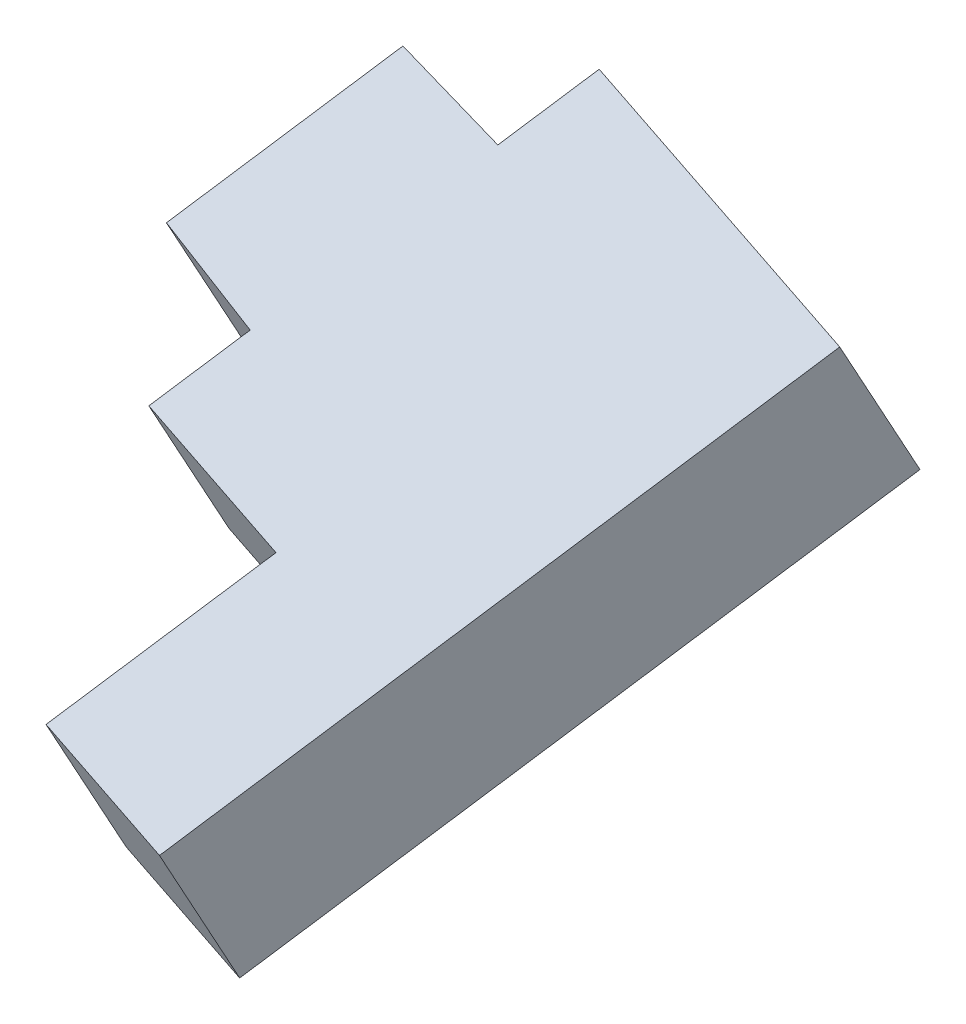
ISO-10303-21;
HEADER;
FILE_DESCRIPTION(('STEP AP214'),'2;1');
FILE_NAME('part.step','',(''),(''),'','','');
FILE_SCHEMA(('AUTOMOTIVE_DESIGN { 1 0 10303 214 1 1 1 1 }'));
ENDSEC;
DATA;
#1=APPLICATION_CONTEXT('core data for automotive mechanical design processes');
#2=APPLICATION_PROTOCOL_DEFINITION('international standard','automotive_design',2000,#1);
#3=PRODUCT_CONTEXT('',#1,'mechanical');
#4=PRODUCT('Part','Part','',(#3));
#5=PRODUCT_RELATED_PRODUCT_CATEGORY('part','',(#4));
#6=PRODUCT_DEFINITION_FORMATION('','',#4);
#7=PRODUCT_DEFINITION_CONTEXT('part definition',#1,'design');
#8=PRODUCT_DEFINITION('design','',#6,#7);
#9=PRODUCT_DEFINITION_SHAPE('','',#8);
#10=(LENGTH_UNIT() NAMED_UNIT(*) SI_UNIT(.MILLI.,.METRE.));
#11=(NAMED_UNIT(*) PLANE_ANGLE_UNIT() SI_UNIT($,.RADIAN.));
#12=(NAMED_UNIT(*) SI_UNIT($,.STERADIAN.) SOLID_ANGLE_UNIT());
#13=UNCERTAINTY_MEASURE_WITH_UNIT(LENGTH_MEASURE(1.E-05),#10,'distance_accuracy_value','');
#14=(GEOMETRIC_REPRESENTATION_CONTEXT(3) GLOBAL_UNCERTAINTY_ASSIGNED_CONTEXT((#13)) GLOBAL_UNIT_ASSIGNED_CONTEXT((#10,
#11,#12)) REPRESENTATION_CONTEXT('',''));
#15=CARTESIAN_POINT('',(0.,0.,0.));
#16=DIRECTION('',(0.,0.,1.));
#17=DIRECTION('',(1.,0.,0.));
#18=AXIS2_PLACEMENT_3D('',#15,#16,#17);
#19=CARTESIAN_POINT('',(-21.5484862330161,269.739443662729,-65.2653013321246));
#20=DIRECTION('',(0.282555355269363,0.449026404664586,-0.84766606580811));
#21=DIRECTION('',(0.,0.883674940467671,0.468101057026641));
#22=AXIS2_PLACEMENT_3D('',#19,#20,#21);
#23=PLANE('',#22);
#24=DIRECTION('',(0.948683298050516,0.,0.316227766016831));
#25=VECTOR('',#24,1.);
#26=CARTESIAN_POINT('',(-20.6965185320382,264.378332736353,-67.8212044350583));
#27=LINE('',#26,#25);
#28=CARTESIAN_POINT('',(-27.9254852631831,264.378332736353,-70.2308600121066));
#29=VERTEX_POINT('',#28);
#30=CARTESIAN_POINT('',(-20.6965185320382,264.378332736353,-67.8212044350583));
#31=VERTEX_POINT('',#30);
#32=EDGE_CURVE('E152',#29,#31,#27,.T.);
#33=ORIENTED_EDGE('',*,*,#32,.T.);
#34=DIRECTION('',(0.141994616829656,-0.893518487729266,-0.425983850488964));
#35=VECTOR('',#34,1.);
#36=CARTESIAN_POINT('',(-21.5484862330161,269.739443662729,-65.2653013321246));
#37=LINE('',#36,#35);
#38=CARTESIAN_POINT('',(-21.5484862330161,269.739443662729,-65.2653013321246));
#39=VERTEX_POINT('',#38);
#40=EDGE_CURVE('E11',#39,#31,#37,.T.);
#41=ORIENTED_EDGE('',*,*,#40,.F.);
#42=DIRECTION('',(0.948683298050516,0.,0.316227766016831));
#43=VECTOR('',#42,1.);
#44=CARTESIAN_POINT('',(-21.5484862330161,269.739443662729,-65.2653013321246));
#45=LINE('',#44,#43);
#46=CARTESIAN_POINT('',(-28.7774529641611,269.739443662729,-67.6749569091728));
#47=VERTEX_POINT('',#46);
#48=EDGE_CURVE('E180',#47,#39,#45,.T.);
#49=ORIENTED_EDGE('',*,*,#48,.F.);
#50=DIRECTION('',(0.141994616829656,-0.893518487729266,-0.425983850488964));
#51=VECTOR('',#50,1.);
#52=CARTESIAN_POINT('',(-28.7774529641611,269.739443662729,-67.6749569091728));
#53=LINE('',#52,#51);
#54=EDGE_CURVE('E148',#47,#29,#53,.T.);
#55=ORIENTED_EDGE('',*,*,#54,.T.);
#56=EDGE_LOOP('',(#33,#41,#49,#55));
#57=FACE_BOUND('',#56,.T.);
#58=ADVANCED_FACE('F39',(#57),#23,.F.);
#59=CARTESIAN_POINT('',(-14.3231504377463,281.22167712297,-86.9413087179341));
#60=DIRECTION('',(-0.948683298050514,0.,-0.316227766016837));
#61=DIRECTION('',(-0.316227766016837,0.,0.948683298050514));
#62=AXIS2_PLACEMENT_3D('',#59,#60,#61);
#63=PLANE('',#62);
#64=DIRECTION('',(0.282555355269368,0.449026404664587,-0.847666065808108));
#65=VECTOR('',#64,1.);
#66=CARTESIAN_POINT('',(-13.4711827367684,275.860566196595,-89.4972118208679));
#67=LINE('',#66,#65);
#68=CARTESIAN_POINT('',(-13.4711827367684,275.860566196595,-89.4972118208679));
#69=VERTEX_POINT('',#68);
#70=EDGE_CURVE('E156',#31,#69,#67,.T.);
#71=ORIENTED_EDGE('',*,*,#70,.T.);
#72=DIRECTION('',(0.141994616829656,-0.893518487729266,-0.425983850488964));
#73=VECTOR('',#72,1.);
#74=CARTESIAN_POINT('',(-14.3231504377463,281.22167712297,-86.9413087179341));
#75=LINE('',#74,#73);
#76=CARTESIAN_POINT('',(-14.3231504377463,281.22167712297,-86.9413087179341));
#77=VERTEX_POINT('',#76);
#78=EDGE_CURVE('E48',#77,#69,#75,.T.);
#79=ORIENTED_EDGE('',*,*,#78,.F.);
#80=DIRECTION('',(0.282555355269368,0.449026404664587,-0.847666065808108));
#81=VECTOR('',#80,1.);
#82=CARTESIAN_POINT('',(-14.3231504377463,281.22167712297,-86.9413087179341));
#83=LINE('',#82,#81);
#84=EDGE_CURVE('E105',#39,#77,#83,.T.);
#85=ORIENTED_EDGE('',*,*,#84,.F.);
#86=ORIENTED_EDGE('',*,*,#40,.T.);
#87=EDGE_LOOP('',(#71,#79,#85,#86));
#88=FACE_BOUND('',#87,.T.);
#89=ADVANCED_FACE('F244',(#88),#63,.F.);
#90=CARTESIAN_POINT('',(-29.6538725342426,281.22167712297,-92.0515494167662));
#91=DIRECTION('',(-0.282555355269367,-0.449026404664586,0.847666065808109));
#92=DIRECTION('',(0.,-0.88367494046767,-0.468101057026642));
#93=AXIS2_PLACEMENT_3D('',#90,#91,#92);
#94=PLANE('',#93);
#95=DIRECTION('',(-0.948683298050514,0.,-0.316227766016836));
#96=VECTOR('',#95,1.);
#97=CARTESIAN_POINT('',(-28.8019048332646,275.860566196594,-94.6074525197));
#98=LINE('',#97,#96);
#99=CARTESIAN_POINT('',(-28.8019048332646,275.860566196594,-94.6074525197));
#100=VERTEX_POINT('',#99);
#101=EDGE_CURVE('E159',#69,#100,#98,.T.);
#102=ORIENTED_EDGE('',*,*,#101,.T.);
#103=DIRECTION('',(0.141994616829656,-0.893518487729266,-0.425983850488964));
#104=VECTOR('',#103,1.);
#105=CARTESIAN_POINT('',(-29.6538725342426,281.22167712297,-92.0515494167662));
#106=LINE('',#105,#104);
#107=CARTESIAN_POINT('',(-29.6538725342426,281.22167712297,-92.0515494167662));
#108=VERTEX_POINT('',#107);
#109=EDGE_CURVE('E199',#108,#100,#106,.T.);
#110=ORIENTED_EDGE('',*,*,#109,.F.);
#111=DIRECTION('',(-0.948683298050514,0.,-0.316227766016836));
#112=VECTOR('',#111,1.);
#113=CARTESIAN_POINT('',(-29.6538725342426,281.22167712297,-92.0515494167662));
#114=LINE('',#113,#112);
#115=EDGE_CURVE('E209',#77,#108,#114,.T.);
#116=ORIENTED_EDGE('',*,*,#115,.F.);
#117=ORIENTED_EDGE('',*,*,#78,.T.);
#118=EDGE_LOOP('',(#102,#110,#116,#117));
#119=FACE_BOUND('',#118,.T.);
#120=ADVANCED_FACE('F207',(#119),#94,.F.);
#121=CARTESIAN_POINT('',(-30.7304084378189,279.510886521198,-88.8219417060373));
#122=DIRECTION('',(0.948683298050513,0.,0.316227766016839));
#123=DIRECTION('',(0.31622776601684,0.,-0.948683298050513));
#124=AXIS2_PLACEMENT_3D('',#121,#122,#123);
#125=PLANE('',#124);
#126=DIRECTION('',(-0.28255535526937,-0.449026404664588,0.847666065808107));
#127=VECTOR('',#126,1.);
#128=CARTESIAN_POINT('',(-29.878440736841,274.149775594822,-91.377844808971));
#129=LINE('',#128,#127);
#130=CARTESIAN_POINT('',(-29.878440736841,274.149775594822,-91.377844808971));
#131=VERTEX_POINT('',#130);
#132=EDGE_CURVE('E162',#100,#131,#129,.T.);
#133=ORIENTED_EDGE('',*,*,#132,.T.);
#134=DIRECTION('',(0.141994616829656,-0.893518487729266,-0.425983850488964));
#135=VECTOR('',#134,1.);
#136=CARTESIAN_POINT('',(-30.7304084378189,279.510886521198,-88.8219417060373));
#137=LINE('',#136,#135);
#138=CARTESIAN_POINT('',(-30.7304084378189,279.510886521198,-88.8219417060373));
#139=VERTEX_POINT('',#138);
#140=EDGE_CURVE('E195',#139,#131,#137,.T.);
#141=ORIENTED_EDGE('',*,*,#140,.F.);
#142=DIRECTION('',(-0.28255535526937,-0.449026404664588,0.847666065808107));
#143=VECTOR('',#142,1.);
#144=CARTESIAN_POINT('',(-30.7304084378189,279.510886521198,-88.8219417060373));
#145=LINE('',#144,#143);
#146=EDGE_CURVE('E228',#108,#139,#145,.T.);
#147=ORIENTED_EDGE('',*,*,#146,.F.);
#148=ORIENTED_EDGE('',*,*,#109,.T.);
#149=EDGE_LOOP('',(#133,#141,#147,#148));
#150=FACE_BOUND('',#149,.T.);
#151=ADVANCED_FACE('F218',(#150),#125,.F.);
#152=CARTESIAN_POINT('',(-36.4817105287021,279.41680443576,-90.5417013943979));
#153=DIRECTION('',(-0.249274660549287,-0.448752869911152,0.858185880421335));
#154=DIRECTION('',(0.,-0.886159426893029,-0.463380480953415));
#155=AXIS2_PLACEMENT_3D('',#152,#153,#154);
#156=PLANE('',#155);
#157=DIRECTION('',(-0.957966425507407,-0.0156707955289341,-0.286452009537467));
#158=VECTOR('',#157,1.);
#159=CARTESIAN_POINT('',(-35.6297428277242,274.055693509384,-93.0976044973316));
#160=LINE('',#159,#158);
#161=CARTESIAN_POINT('',(-35.6297428277242,274.055693509384,-93.0976044973316));
#162=VERTEX_POINT('',#161);
#163=EDGE_CURVE('E165',#131,#162,#160,.T.);
#164=ORIENTED_EDGE('',*,*,#163,.T.);
#165=DIRECTION('',(0.141994616829656,-0.893518487729266,-0.425983850488964));
#166=VECTOR('',#165,1.);
#167=CARTESIAN_POINT('',(-36.4817105287021,279.41680443576,-90.5417013943979));
#168=LINE('',#167,#166);
#169=CARTESIAN_POINT('',(-36.4817105287021,279.41680443576,-90.5417013943979));
#170=VERTEX_POINT('',#169);
#171=EDGE_CURVE('E191',#170,#162,#168,.T.);
#172=ORIENTED_EDGE('',*,*,#171,.F.);
#173=DIRECTION('',(-0.957966425507407,-0.0156707955289341,-0.286452009537467));
#174=VECTOR('',#173,1.);
#175=CARTESIAN_POINT('',(-36.4817105287021,279.41680443576,-90.5417013943979));
#176=LINE('',#175,#174);
#177=EDGE_CURVE('E224',#139,#170,#176,.T.);
#178=ORIENTED_EDGE('',*,*,#177,.F.);
#179=ORIENTED_EDGE('',*,*,#140,.T.);
#180=EDGE_LOOP('',(#164,#172,#178,#179));
#181=FACE_BOUND('',#180,.T.);
#182=ADVANCED_FACE('F222',(#181),#156,.F.);
#183=CARTESIAN_POINT('',(-38.9936276370468,275.424959698292,-83.0059500693637));
#184=DIRECTION('',(0.948683298050514,0.,0.316227766016837));
#185=DIRECTION('',(0.316227766016837,0.,-0.948683298050514));
#186=AXIS2_PLACEMENT_3D('',#183,#184,#185);
#187=PLANE('',#186);
#188=DIRECTION('',(-0.282555355269368,-0.449026404664584,0.84766606580811));
#189=VECTOR('',#188,1.);
#190=CARTESIAN_POINT('',(-38.1416599360689,270.063848771916,-85.5618531722975));
#191=LINE('',#190,#189);
#192=CARTESIAN_POINT('',(-38.1416599360689,270.063848771916,-85.5618531722975));
#193=VERTEX_POINT('',#192);
#194=EDGE_CURVE('E168',#162,#193,#191,.T.);
#195=ORIENTED_EDGE('',*,*,#194,.T.);
#196=DIRECTION('',(0.141994616829656,-0.893518487729266,-0.425983850488964));
#197=VECTOR('',#196,1.);
#198=CARTESIAN_POINT('',(-38.9936276370468,275.424959698292,-83.0059500693637));
#199=LINE('',#198,#197);
#200=CARTESIAN_POINT('',(-38.9936276370468,275.424959698292,-83.0059500693637));
#201=VERTEX_POINT('',#200);
#202=EDGE_CURVE('E187',#201,#193,#199,.T.);
#203=ORIENTED_EDGE('',*,*,#202,.F.);
#204=DIRECTION('',(-0.282555355269368,-0.449026404664584,0.84766606580811));
#205=VECTOR('',#204,1.);
#206=CARTESIAN_POINT('',(-38.9936276370468,275.424959698292,-83.0059500693637));
#207=LINE('',#206,#205);
#208=EDGE_CURVE('E227',#170,#201,#207,.T.);
#209=ORIENTED_EDGE('',*,*,#208,.F.);
#210=ORIENTED_EDGE('',*,*,#171,.T.);
#211=EDGE_LOOP('',(#195,#203,#209,#210));
#212=FACE_BOUND('',#211,.T.);
#213=ADVANCED_FACE('F256',(#212),#187,.F.);
#214=CARTESIAN_POINT('',(-33.3607301513238,275.330877612854,-80.9309765655224));
#215=DIRECTION('',(0.315491799813352,0.448752869911152,-0.836113500666648));
#216=DIRECTION('',(0.,0.881113460327662,0.47290492705132));
#217=AXIS2_PLACEMENT_3D('',#214,#215,#216);
#218=PLANE('',#217);
#219=DIRECTION('',(0.938244346128412,-0.0156707955289247,0.345618247674452));
#220=VECTOR('',#219,1.);
#221=CARTESIAN_POINT('',(-32.5087624503458,269.969766686478,-83.4868796684562));
#222=LINE('',#221,#220);
#223=CARTESIAN_POINT('',(-32.5087624503458,269.969766686478,-83.4868796684562));
#224=VERTEX_POINT('',#223);
#225=EDGE_CURVE('E171',#193,#224,#222,.T.);
#226=ORIENTED_EDGE('',*,*,#225,.T.);
#227=DIRECTION('',(0.141994616829656,-0.893518487729266,-0.425983850488964));
#228=VECTOR('',#227,1.);
#229=CARTESIAN_POINT('',(-33.3607301513238,275.330877612854,-80.9309765655224));
#230=LINE('',#229,#228);
#231=CARTESIAN_POINT('',(-33.3607301513238,275.330877612854,-80.9309765655224));
#232=VERTEX_POINT('',#231);
#233=EDGE_CURVE('E141',#232,#224,#230,.T.);
#234=ORIENTED_EDGE('',*,*,#233,.F.);
#235=DIRECTION('',(0.938244346128412,-0.0156707955289247,0.345618247674452));
#236=VECTOR('',#235,1.);
#237=CARTESIAN_POINT('',(-33.3607301513238,275.330877612854,-80.9309765655224));
#238=LINE('',#237,#236);
#239=EDGE_CURVE('E130',#201,#232,#238,.T.);
#240=ORIENTED_EDGE('',*,*,#239,.F.);
#241=ORIENTED_EDGE('',*,*,#202,.T.);
#242=EDGE_LOOP('',(#226,#234,#240,#241));
#243=FACE_BOUND('',#242,.T.);
#244=ADVANCED_FACE('F259',(#243),#218,.F.);
#245=CARTESIAN_POINT('',(-34.4372660549001,273.620087011082,-77.7013688547935));
#246=DIRECTION('',(0.948683298050514,0.,0.316227766016836));
#247=DIRECTION('',(0.316227766016836,0.,-0.948683298050514));
#248=AXIS2_PLACEMENT_3D('',#245,#246,#247);
#249=PLANE('',#248);
#250=DIRECTION('',(-0.282555355269366,-0.449026404664591,0.847666065808106));
#251=VECTOR('',#250,1.);
#252=CARTESIAN_POINT('',(-33.5852983539221,268.258976084706,-80.2572719577273));
#253=LINE('',#252,#251);
#254=CARTESIAN_POINT('',(-33.5852983539221,268.258976084706,-80.2572719577273));
#255=VERTEX_POINT('',#254);
#256=EDGE_CURVE('E139',#224,#255,#253,.T.);
#257=ORIENTED_EDGE('',*,*,#256,.T.);
#258=DIRECTION('',(0.141994616829656,-0.893518487729266,-0.425983850488964));
#259=VECTOR('',#258,1.);
#260=CARTESIAN_POINT('',(-34.4372660549001,273.620087011082,-77.7013688547935));
#261=LINE('',#260,#259);
#262=CARTESIAN_POINT('',(-34.4372660549001,273.620087011082,-77.7013688547935));
#263=VERTEX_POINT('',#262);
#264=EDGE_CURVE('E136',#263,#255,#261,.T.);
#265=ORIENTED_EDGE('',*,*,#264,.F.);
#266=DIRECTION('',(-0.282555355269366,-0.449026404664591,0.847666065808106));
#267=VECTOR('',#266,1.);
#268=CARTESIAN_POINT('',(-34.4372660549001,273.620087011082,-77.7013688547935));
#269=LINE('',#268,#267);
#270=EDGE_CURVE('E124',#232,#263,#269,.T.);
#271=ORIENTED_EDGE('',*,*,#270,.F.);
#272=ORIENTED_EDGE('',*,*,#233,.T.);
#273=EDGE_LOOP('',(#257,#265,#271,#272));
#274=FACE_BOUND('',#273,.T.);
#275=ADVANCED_FACE('F137',(#274),#249,.F.);
#276=CARTESIAN_POINT('',(-26.3355106895487,273.620087011082,-75.0007837330097));
#277=DIRECTION('',(0.282555355269365,0.449026404664586,-0.84766606580811));
#278=DIRECTION('',(0.,0.883674940467671,0.468101057026641));
#279=AXIS2_PLACEMENT_3D('',#276,#277,#278);
#280=PLANE('',#279);
#281=DIRECTION('',(0.948683298050515,0.,0.316227766016836));
#282=VECTOR('',#281,1.);
#283=CARTESIAN_POINT('',(-25.4835429885708,268.258976084706,-77.5566868359435));
#284=LINE('',#283,#282);
#285=CARTESIAN_POINT('',(-25.4835429885708,268.258976084706,-77.5566868359435));
#286=VERTEX_POINT('',#285);
#287=EDGE_CURVE('E91',#255,#286,#284,.T.);
#288=ORIENTED_EDGE('',*,*,#287,.T.);
#289=DIRECTION('',(0.141994616829656,-0.893518487729266,-0.425983850488964));
#290=VECTOR('',#289,1.);
#291=CARTESIAN_POINT('',(-26.3355106895487,273.620087011082,-75.0007837330097));
#292=LINE('',#291,#290);
#293=CARTESIAN_POINT('',(-26.3355106895487,273.620087011082,-75.0007837330097));
#294=VERTEX_POINT('',#293);
#295=EDGE_CURVE('E142',#294,#286,#292,.T.);
#296=ORIENTED_EDGE('',*,*,#295,.F.);
#297=DIRECTION('',(0.948683298050515,0.,0.316227766016836));
#298=VECTOR('',#297,1.);
#299=CARTESIAN_POINT('',(-26.3355106895487,273.620087011082,-75.0007837330097));
#300=LINE('',#299,#298);
#301=EDGE_CURVE('E128',#263,#294,#300,.T.);
#302=ORIENTED_EDGE('',*,*,#301,.F.);
#303=ORIENTED_EDGE('',*,*,#264,.T.);
#304=EDGE_LOOP('',(#288,#296,#302,#303));
#305=FACE_BOUND('',#304,.T.);
#306=ADVANCED_FACE('F144',(#305),#280,.F.);
#307=CARTESIAN_POINT('',(-28.7774529641611,269.739443662729,-67.6749569091728));
#308=DIRECTION('',(0.948683298050513,0.,0.31622776601684));
#309=DIRECTION('',(0.31622776601684,0.,-0.948683298050513));
#310=AXIS2_PLACEMENT_3D('',#307,#308,#309);
#311=PLANE('',#310);
#312=DIRECTION('',(-0.282555355269371,-0.449026404664584,0.847666065808108));
#313=VECTOR('',#312,1.);
#314=CARTESIAN_POINT('',(-27.9254852631831,264.378332736353,-70.2308600121066));
#315=LINE('',#314,#313);
#316=EDGE_CURVE('E97',#286,#29,#315,.T.);
#317=ORIENTED_EDGE('',*,*,#316,.T.);
#318=ORIENTED_EDGE('',*,*,#54,.F.);
#319=DIRECTION('',(-0.282555355269371,-0.449026404664584,0.847666065808108));
#320=VECTOR('',#319,1.);
#321=CARTESIAN_POINT('',(-28.7774529641611,269.739443662729,-67.6749569091728));
#322=LINE('',#321,#320);
#323=EDGE_CURVE('E56',#294,#47,#322,.T.);
#324=ORIENTED_EDGE('',*,*,#323,.F.);
#325=ORIENTED_EDGE('',*,*,#295,.T.);
#326=EDGE_LOOP('',(#317,#318,#324,#325));
#327=FACE_BOUND('',#326,.T.);
#328=ADVANCED_FACE('F268',(#327),#311,.F.);
#329=CARTESIAN_POINT('',(-30.7098835487463,193.245697051578,92.129650646241));
#330=DIRECTION('',(0.141994616829651,-0.893518487729267,-0.425983850488964));
#331=DIRECTION('',(0.,0.43034434472587,-0.902664802106774));
#332=AXIS2_PLACEMENT_3D('',#329,#330,#331);
#333=PLANE('',#332);
#334=ORIENTED_EDGE('',*,*,#48,.T.);
#335=ORIENTED_EDGE('',*,*,#84,.T.);
#336=ORIENTED_EDGE('',*,*,#115,.T.);
#337=ORIENTED_EDGE('',*,*,#146,.T.);
#338=ORIENTED_EDGE('',*,*,#177,.T.);
#339=ORIENTED_EDGE('',*,*,#208,.T.);
#340=ORIENTED_EDGE('',*,*,#239,.T.);
#341=ORIENTED_EDGE('',*,*,#270,.T.);
#342=ORIENTED_EDGE('',*,*,#301,.T.);
#343=ORIENTED_EDGE('',*,*,#323,.T.);
#344=EDGE_LOOP('',(#334,#335,#336,#337,#338,#339,#340,#341,#342,#343));
#345=FACE_BOUND('',#344,.T.);
#346=ADVANCED_FACE('F126',(#345),#333,.F.);
#347=CARTESIAN_POINT('',(-29.8579158477684,187.884586125203,89.5737475433072));
#348=DIRECTION('',(0.141994616829651,-0.893518487729267,-0.425983850488964));
#349=DIRECTION('',(0.,0.43034434472587,-0.902664802106774));
#350=AXIS2_PLACEMENT_3D('',#347,#348,#349);
#351=PLANE('',#350);
#352=ORIENTED_EDGE('',*,*,#32,.F.);
#353=ORIENTED_EDGE('',*,*,#316,.F.);
#354=ORIENTED_EDGE('',*,*,#287,.F.);
#355=ORIENTED_EDGE('',*,*,#256,.F.);
#356=ORIENTED_EDGE('',*,*,#225,.F.);
#357=ORIENTED_EDGE('',*,*,#194,.F.);
#358=ORIENTED_EDGE('',*,*,#163,.F.);
#359=ORIENTED_EDGE('',*,*,#132,.F.);
#360=ORIENTED_EDGE('',*,*,#101,.F.);
#361=ORIENTED_EDGE('',*,*,#70,.F.);
#362=EDGE_LOOP('',(#352,#353,#354,#355,#356,#357,#358,#359,#360,#361));
#363=FACE_BOUND('',#362,.T.);
#364=ADVANCED_FACE('F213',(#363),#351,.T.);
#365=CLOSED_SHELL('',(#58,#89,#120,#151,#182,#213,#244,#275,#306,#328,#346,#364));
#366=MANIFOLD_SOLID_BREP('B2',#365);
#367=ADVANCED_BREP_SHAPE_REPRESENTATION('',(#18,#366),#14);
#368=SHAPE_DEFINITION_REPRESENTATION(#9,#367);
ENDSEC;
END-ISO-10303-21;
